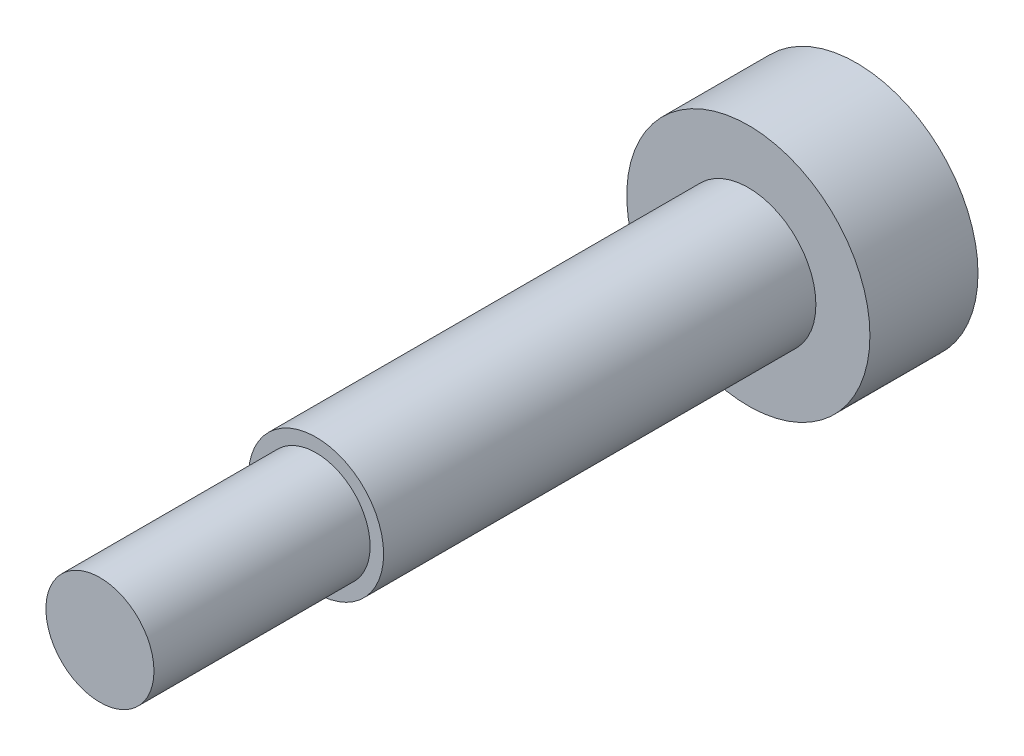
ISO-10303-21;
HEADER;
FILE_DESCRIPTION(('STEP AP214'),'2;1');
FILE_NAME('part.step','',(''),(''),'','','');
FILE_SCHEMA(('AUTOMOTIVE_DESIGN { 1 0 10303 214 1 1 1 1 }'));
ENDSEC;
DATA;
#1=APPLICATION_CONTEXT('core data for automotive mechanical design processes');
#2=APPLICATION_PROTOCOL_DEFINITION('international standard','automotive_design',2000,#1);
#3=PRODUCT_CONTEXT('',#1,'mechanical');
#4=PRODUCT('Part','Part','',(#3));
#5=PRODUCT_RELATED_PRODUCT_CATEGORY('part','',(#4));
#6=PRODUCT_DEFINITION_FORMATION('','',#4);
#7=PRODUCT_DEFINITION_CONTEXT('part definition',#1,'design');
#8=PRODUCT_DEFINITION('design','',#6,#7);
#9=PRODUCT_DEFINITION_SHAPE('','',#8);
#10=(LENGTH_UNIT() NAMED_UNIT(*) SI_UNIT(.MILLI.,.METRE.));
#11=(NAMED_UNIT(*) PLANE_ANGLE_UNIT() SI_UNIT($,.RADIAN.));
#12=(NAMED_UNIT(*) SI_UNIT($,.STERADIAN.) SOLID_ANGLE_UNIT());
#13=UNCERTAINTY_MEASURE_WITH_UNIT(LENGTH_MEASURE(1.E-05),#10,'distance_accuracy_value','');
#14=(GEOMETRIC_REPRESENTATION_CONTEXT(3) GLOBAL_UNCERTAINTY_ASSIGNED_CONTEXT((#13)) GLOBAL_UNIT_ASSIGNED_CONTEXT((#10,
#11,#12)) REPRESENTATION_CONTEXT('',''));
#15=CARTESIAN_POINT('',(0.,0.,0.));
#16=DIRECTION('',(0.,0.,1.));
#17=DIRECTION('',(1.,0.,0.));
#18=AXIS2_PLACEMENT_3D('',#15,#16,#17);
#19=CARTESIAN_POINT('',(0.,0.,-4.));
#20=DIRECTION('',(0.,0.,1.));
#21=DIRECTION('',(1.,0.,0.));
#22=AXIS2_PLACEMENT_3D('',#19,#20,#21);
#23=PLANE('',#22);
#24=CARTESIAN_POINT('',(0.,0.,-4.));
#25=DIRECTION('',(0.,0.,1.));
#26=DIRECTION('',(1.,0.,0.));
#27=AXIS2_PLACEMENT_3D('',#24,#25,#26);
#28=CIRCLE('',#27,4.5);
#29=CARTESIAN_POINT('',(4.5,0.,-4.));
#30=VERTEX_POINT('',#29);
#31=EDGE_CURVE('E110',#30,#30,#28,.T.);
#32=ORIENTED_EDGE('',*,*,#31,.F.);
#33=EDGE_LOOP('',(#32));
#34=FACE_BOUND('',#33,.T.);
#35=DIRECTION('',(-0.5,-0.866025403784439,0.));
#36=VECTOR('',#35,1.);
#37=CARTESIAN_POINT('',(1.08253175473055,-0.625,-4.));
#38=LINE('',#37,#36);
#39=CARTESIAN_POINT('',(1.44337567297406,0.,-4.));
#40=VERTEX_POINT('',#39);
#41=CARTESIAN_POINT('',(0.721687836487032,-1.25,-4.));
#42=VERTEX_POINT('',#41);
#43=EDGE_CURVE('E11',#40,#42,#38,.T.);
#44=ORIENTED_EDGE('',*,*,#43,.F.);
#45=DIRECTION('',(0.5,-0.866025403784439,0.));
#46=VECTOR('',#45,1.);
#47=CARTESIAN_POINT('',(1.08253175473055,0.625,-4.));
#48=LINE('',#47,#46);
#49=CARTESIAN_POINT('',(0.721687836487032,1.25,-4.));
#50=VERTEX_POINT('',#49);
#51=EDGE_CURVE('E50',#50,#40,#48,.T.);
#52=ORIENTED_EDGE('',*,*,#51,.F.);
#53=DIRECTION('',(1.,0.,0.));
#54=VECTOR('',#53,1.);
#55=CARTESIAN_POINT('',(0.,1.25,-4.));
#56=LINE('',#55,#54);
#57=CARTESIAN_POINT('',(-0.721687836487032,1.25,-4.));
#58=VERTEX_POINT('',#57);
#59=EDGE_CURVE('E137',#58,#50,#56,.T.);
#60=ORIENTED_EDGE('',*,*,#59,.F.);
#61=DIRECTION('',(0.5,0.866025403784439,0.));
#62=VECTOR('',#61,1.);
#63=CARTESIAN_POINT('',(-1.08253175473055,0.625,-4.));
#64=LINE('',#63,#62);
#65=CARTESIAN_POINT('',(-1.44337567297406,0.,-4.));
#66=VERTEX_POINT('',#65);
#67=EDGE_CURVE('E134',#66,#58,#64,.T.);
#68=ORIENTED_EDGE('',*,*,#67,.F.);
#69=DIRECTION('',(-0.5,0.866025403784439,0.));
#70=VECTOR('',#69,1.);
#71=CARTESIAN_POINT('',(-1.08253175473055,-0.625,-4.));
#72=LINE('',#71,#70);
#73=CARTESIAN_POINT('',(-0.721687836487033,-1.25,-4.));
#74=VERTEX_POINT('',#73);
#75=EDGE_CURVE('E132',#74,#66,#72,.T.);
#76=ORIENTED_EDGE('',*,*,#75,.F.);
#77=DIRECTION('',(-1.,0.,0.));
#78=VECTOR('',#77,1.);
#79=CARTESIAN_POINT('',(0.,-1.25,-4.));
#80=LINE('',#79,#78);
#81=EDGE_CURVE('E130',#42,#74,#80,.T.);
#82=ORIENTED_EDGE('',*,*,#81,.F.);
#83=EDGE_LOOP('',(#44,#52,#60,#68,#76,#82));
#84=FACE_BOUND('',#83,.T.);
#85=ADVANCED_FACE('F39',(#34,#84),#23,.F.);
#86=CARTESIAN_POINT('',(0.,0.,16.));
#87=DIRECTION('',(0.,0.,-1.));
#88=DIRECTION('',(-1.,0.,0.));
#89=AXIS2_PLACEMENT_3D('',#86,#87,#88);
#90=CYLINDRICAL_SURFACE('',#89,2.5);
#91=CARTESIAN_POINT('',(0.,0.,16.));
#92=DIRECTION('',(0.,0.,1.));
#93=DIRECTION('',(1.,0.,0.));
#94=AXIS2_PLACEMENT_3D('',#91,#92,#93);
#95=CIRCLE('',#94,2.5);
#96=CARTESIAN_POINT('',(2.5,0.,16.));
#97=VERTEX_POINT('',#96);
#98=EDGE_CURVE('E124',#97,#97,#95,.T.);
#99=ORIENTED_EDGE('',*,*,#98,.F.);
#100=EDGE_LOOP('',(#99));
#101=FACE_BOUND('',#100,.T.);
#102=CARTESIAN_POINT('',(0.,0.,0.));
#103=DIRECTION('',(0.,0.,1.));
#104=DIRECTION('',(1.,0.,0.));
#105=AXIS2_PLACEMENT_3D('',#102,#103,#104);
#106=CIRCLE('',#105,2.5);
#107=CARTESIAN_POINT('',(2.5,0.,0.));
#108=VERTEX_POINT('',#107);
#109=EDGE_CURVE('E117',#108,#108,#106,.T.);
#110=ORIENTED_EDGE('',*,*,#109,.T.);
#111=EDGE_LOOP('',(#110));
#112=FACE_BOUND('',#111,.T.);
#113=ADVANCED_FACE('F41',(#101,#112),#90,.T.);
#114=CARTESIAN_POINT('',(0.,0.,16.));
#115=DIRECTION('',(0.,0.,1.));
#116=DIRECTION('',(1.,0.,0.));
#117=AXIS2_PLACEMENT_3D('',#114,#115,#116);
#118=PLANE('',#117);
#119=CARTESIAN_POINT('',(0.,0.,16.));
#120=DIRECTION('',(0.,0.,1.));
#121=DIRECTION('',(1.,0.,0.));
#122=AXIS2_PLACEMENT_3D('',#119,#120,#121);
#123=CIRCLE('',#122,2.);
#124=CARTESIAN_POINT('',(2.,0.,16.));
#125=VERTEX_POINT('',#124);
#126=EDGE_CURVE('E121',#125,#125,#123,.T.);
#127=ORIENTED_EDGE('',*,*,#126,.F.);
#128=EDGE_LOOP('',(#127));
#129=FACE_BOUND('',#128,.T.);
#130=ORIENTED_EDGE('',*,*,#98,.T.);
#131=EDGE_LOOP('',(#130));
#132=FACE_BOUND('',#131,.T.);
#133=ADVANCED_FACE('F184',(#129,#132),#118,.T.);
#134=CARTESIAN_POINT('',(0.,0.,24.));
#135=DIRECTION('',(0.,0.,-1.));
#136=DIRECTION('',(-1.,0.,0.));
#137=AXIS2_PLACEMENT_3D('',#134,#135,#136);
#138=CYLINDRICAL_SURFACE('',#137,2.);
#139=CARTESIAN_POINT('',(0.,0.,24.));
#140=DIRECTION('',(0.,0.,1.));
#141=DIRECTION('',(1.,0.,0.));
#142=AXIS2_PLACEMENT_3D('',#139,#140,#141);
#143=CIRCLE('',#142,2.);
#144=CARTESIAN_POINT('',(2.,0.,24.));
#145=VERTEX_POINT('',#144);
#146=EDGE_CURVE('E119',#145,#145,#143,.T.);
#147=ORIENTED_EDGE('',*,*,#146,.F.);
#148=EDGE_LOOP('',(#147));
#149=FACE_BOUND('',#148,.T.);
#150=ORIENTED_EDGE('',*,*,#126,.T.);
#151=EDGE_LOOP('',(#150));
#152=FACE_BOUND('',#151,.T.);
#153=ADVANCED_FACE('F198',(#149,#152),#138,.T.);
#154=CARTESIAN_POINT('',(0.,0.,24.));
#155=DIRECTION('',(0.,0.,1.));
#156=DIRECTION('',(1.,0.,0.));
#157=AXIS2_PLACEMENT_3D('',#154,#155,#156);
#158=PLANE('',#157);
#159=ORIENTED_EDGE('',*,*,#146,.T.);
#160=EDGE_LOOP('',(#159));
#161=FACE_BOUND('',#160,.T.);
#162=ADVANCED_FACE('F193',(#161),#158,.T.);
#163=CARTESIAN_POINT('',(0.,0.,0.));
#164=DIRECTION('',(0.,0.,-1.));
#165=DIRECTION('',(-1.,0.,0.));
#166=AXIS2_PLACEMENT_3D('',#163,#164,#165);
#167=CYLINDRICAL_SURFACE('',#166,4.5);
#168=CARTESIAN_POINT('',(0.,0.,0.));
#169=DIRECTION('',(0.,0.,1.));
#170=DIRECTION('',(1.,0.,0.));
#171=AXIS2_PLACEMENT_3D('',#168,#169,#170);
#172=CIRCLE('',#171,4.5);
#173=CARTESIAN_POINT('',(4.5,0.,0.));
#174=VERTEX_POINT('',#173);
#175=EDGE_CURVE('E111',#174,#174,#172,.T.);
#176=ORIENTED_EDGE('',*,*,#175,.F.);
#177=EDGE_LOOP('',(#176));
#178=FACE_BOUND('',#177,.T.);
#179=ORIENTED_EDGE('',*,*,#31,.T.);
#180=EDGE_LOOP('',(#179));
#181=FACE_BOUND('',#180,.T.);
#182=ADVANCED_FACE('F195',(#178,#181),#167,.T.);
#183=CARTESIAN_POINT('',(0.,0.,0.));
#184=DIRECTION('',(0.,0.,1.));
#185=DIRECTION('',(1.,0.,0.));
#186=AXIS2_PLACEMENT_3D('',#183,#184,#185);
#187=PLANE('',#186);
#188=ORIENTED_EDGE('',*,*,#109,.F.);
#189=EDGE_LOOP('',(#188));
#190=FACE_BOUND('',#189,.T.);
#191=ORIENTED_EDGE('',*,*,#175,.T.);
#192=EDGE_LOOP('',(#191));
#193=FACE_BOUND('',#192,.T.);
#194=ADVANCED_FACE('F188',(#190,#193),#187,.T.);
#195=CARTESIAN_POINT('',(0.721687836487032,-1.25,-1.3));
#196=DIRECTION('',(-0.866025403784439,0.5,0.));
#197=DIRECTION('',(-0.5,-0.866025403784439,0.));
#198=AXIS2_PLACEMENT_3D('',#195,#196,#197);
#199=PLANE('',#198);
#200=ORIENTED_EDGE('',*,*,#43,.T.);
#201=DIRECTION('',(0.,0.,-1.));
#202=VECTOR('',#201,1.);
#203=CARTESIAN_POINT('',(0.721687836487032,-1.25,-1.3));
#204=LINE('',#203,#202);
#205=CARTESIAN_POINT('',(0.721687836487032,-1.25,-1.3));
#206=VERTEX_POINT('',#205);
#207=EDGE_CURVE('E53',#206,#42,#204,.T.);
#208=ORIENTED_EDGE('',*,*,#207,.F.);
#209=DIRECTION('',(0.5,0.866025403784439,0.));
#210=VECTOR('',#209,1.);
#211=CARTESIAN_POINT('',(0.721687836487032,-1.25,-1.3));
#212=LINE('',#211,#210);
#213=CARTESIAN_POINT('',(1.44337567297406,0.,-1.3));
#214=VERTEX_POINT('',#213);
#215=EDGE_CURVE('E98',#206,#214,#212,.T.);
#216=ORIENTED_EDGE('',*,*,#215,.T.);
#217=DIRECTION('',(0.,0.,-1.));
#218=VECTOR('',#217,1.);
#219=CARTESIAN_POINT('',(1.44337567297406,0.,-1.3));
#220=LINE('',#219,#218);
#221=EDGE_CURVE('E101',#214,#40,#220,.T.);
#222=ORIENTED_EDGE('',*,*,#221,.T.);
#223=EDGE_LOOP('',(#200,#208,#216,#222));
#224=FACE_BOUND('',#223,.T.);
#225=ADVANCED_FACE('F105',(#224),#199,.T.);
#226=CARTESIAN_POINT('',(1.44337567297406,0.,-1.3));
#227=DIRECTION('',(-0.866025403784439,-0.5,0.));
#228=DIRECTION('',(0.5,-0.866025403784439,0.));
#229=AXIS2_PLACEMENT_3D('',#226,#227,#228);
#230=PLANE('',#229);
#231=ORIENTED_EDGE('',*,*,#51,.T.);
#232=ORIENTED_EDGE('',*,*,#221,.F.);
#233=DIRECTION('',(-0.5,0.866025403784439,0.));
#234=VECTOR('',#233,1.);
#235=CARTESIAN_POINT('',(1.44337567297406,0.,-1.3));
#236=LINE('',#235,#234);
#237=CARTESIAN_POINT('',(0.721687836487032,1.25,-1.3));
#238=VERTEX_POINT('',#237);
#239=EDGE_CURVE('E92',#214,#238,#236,.T.);
#240=ORIENTED_EDGE('',*,*,#239,.T.);
#241=DIRECTION('',(0.,0.,-1.));
#242=VECTOR('',#241,1.);
#243=CARTESIAN_POINT('',(0.721687836487032,1.25,-1.3));
#244=LINE('',#243,#242);
#245=EDGE_CURVE('E108',#238,#50,#244,.T.);
#246=ORIENTED_EDGE('',*,*,#245,.T.);
#247=EDGE_LOOP('',(#231,#232,#240,#246));
#248=FACE_BOUND('',#247,.T.);
#249=ADVANCED_FACE('F106',(#248),#230,.T.);
#250=CARTESIAN_POINT('',(0.721687836487032,1.25,-1.3));
#251=DIRECTION('',(0.,-1.,0.));
#252=DIRECTION('',(1.,0.,0.));
#253=AXIS2_PLACEMENT_3D('',#250,#251,#252);
#254=PLANE('',#253);
#255=ORIENTED_EDGE('',*,*,#59,.T.);
#256=ORIENTED_EDGE('',*,*,#245,.F.);
#257=DIRECTION('',(-1.,0.,0.));
#258=VECTOR('',#257,1.);
#259=CARTESIAN_POINT('',(0.721687836487032,1.25,-1.3));
#260=LINE('',#259,#258);
#261=CARTESIAN_POINT('',(-0.721687836487032,1.25,-1.3));
#262=VERTEX_POINT('',#261);
#263=EDGE_CURVE('E96',#238,#262,#260,.T.);
#264=ORIENTED_EDGE('',*,*,#263,.T.);
#265=DIRECTION('',(0.,0.,-1.));
#266=VECTOR('',#265,1.);
#267=CARTESIAN_POINT('',(-0.721687836487032,1.25,-1.3));
#268=LINE('',#267,#266);
#269=EDGE_CURVE('E113',#262,#58,#268,.T.);
#270=ORIENTED_EDGE('',*,*,#269,.T.);
#271=EDGE_LOOP('',(#255,#256,#264,#270));
#272=FACE_BOUND('',#271,.T.);
#273=ADVANCED_FACE('F142',(#272),#254,.T.);
#274=CARTESIAN_POINT('',(-0.721687836487032,1.25,-1.3));
#275=DIRECTION('',(0.866025403784439,-0.5,0.));
#276=DIRECTION('',(0.5,0.866025403784439,0.));
#277=AXIS2_PLACEMENT_3D('',#274,#275,#276);
#278=PLANE('',#277);
#279=ORIENTED_EDGE('',*,*,#67,.T.);
#280=ORIENTED_EDGE('',*,*,#269,.F.);
#281=DIRECTION('',(-0.5,-0.866025403784439,0.));
#282=VECTOR('',#281,1.);
#283=CARTESIAN_POINT('',(-0.721687836487032,1.25,-1.3));
#284=LINE('',#283,#282);
#285=CARTESIAN_POINT('',(-1.44337567297406,0.,-1.3));
#286=VERTEX_POINT('',#285);
#287=EDGE_CURVE('E164',#262,#286,#284,.T.);
#288=ORIENTED_EDGE('',*,*,#287,.T.);
#289=DIRECTION('',(0.,0.,-1.));
#290=VECTOR('',#289,1.);
#291=CARTESIAN_POINT('',(-1.44337567297406,0.,-1.3));
#292=LINE('',#291,#290);
#293=EDGE_CURVE('E157',#286,#66,#292,.T.);
#294=ORIENTED_EDGE('',*,*,#293,.T.);
#295=EDGE_LOOP('',(#279,#280,#288,#294));
#296=FACE_BOUND('',#295,.T.);
#297=ADVANCED_FACE('F166',(#296),#278,.T.);
#298=CARTESIAN_POINT('',(-1.44337567297406,0.,-1.3));
#299=DIRECTION('',(0.866025403784439,0.5,0.));
#300=DIRECTION('',(-0.5,0.866025403784439,0.));
#301=AXIS2_PLACEMENT_3D('',#298,#299,#300);
#302=PLANE('',#301);
#303=ORIENTED_EDGE('',*,*,#75,.T.);
#304=ORIENTED_EDGE('',*,*,#293,.F.);
#305=DIRECTION('',(0.5,-0.866025403784439,0.));
#306=VECTOR('',#305,1.);
#307=CARTESIAN_POINT('',(-1.44337567297406,0.,-1.3));
#308=LINE('',#307,#306);
#309=CARTESIAN_POINT('',(-0.721687836487033,-1.25,-1.3));
#310=VERTEX_POINT('',#309);
#311=EDGE_CURVE('E156',#286,#310,#308,.T.);
#312=ORIENTED_EDGE('',*,*,#311,.T.);
#313=DIRECTION('',(0.,0.,-1.));
#314=VECTOR('',#313,1.);
#315=CARTESIAN_POINT('',(-0.721687836487033,-1.25,-1.3));
#316=LINE('',#315,#314);
#317=EDGE_CURVE('E148',#310,#74,#316,.T.);
#318=ORIENTED_EDGE('',*,*,#317,.T.);
#319=EDGE_LOOP('',(#303,#304,#312,#318));
#320=FACE_BOUND('',#319,.T.);
#321=ADVANCED_FACE('F155',(#320),#302,.T.);
#322=CARTESIAN_POINT('',(-0.721687836487033,-1.25,-1.3));
#323=DIRECTION('',(0.,1.,0.));
#324=DIRECTION('',(-1.,0.,0.));
#325=AXIS2_PLACEMENT_3D('',#322,#323,#324);
#326=PLANE('',#325);
#327=ORIENTED_EDGE('',*,*,#81,.T.);
#328=ORIENTED_EDGE('',*,*,#317,.F.);
#329=DIRECTION('',(1.,0.,0.));
#330=VECTOR('',#329,1.);
#331=CARTESIAN_POINT('',(-0.721687836487033,-1.25,-1.3));
#332=LINE('',#331,#330);
#333=EDGE_CURVE('E160',#310,#206,#332,.T.);
#334=ORIENTED_EDGE('',*,*,#333,.T.);
#335=ORIENTED_EDGE('',*,*,#207,.T.);
#336=EDGE_LOOP('',(#327,#328,#334,#335));
#337=FACE_BOUND('',#336,.T.);
#338=ADVANCED_FACE('F146',(#337),#326,.T.);
#339=CARTESIAN_POINT('',(0.,0.,-1.3));
#340=DIRECTION('',(0.,0.,1.));
#341=DIRECTION('',(1.,0.,0.));
#342=AXIS2_PLACEMENT_3D('',#339,#340,#341);
#343=PLANE('',#342);
#344=ORIENTED_EDGE('',*,*,#215,.F.);
#345=ORIENTED_EDGE('',*,*,#333,.F.);
#346=ORIENTED_EDGE('',*,*,#311,.F.);
#347=ORIENTED_EDGE('',*,*,#287,.F.);
#348=ORIENTED_EDGE('',*,*,#263,.F.);
#349=ORIENTED_EDGE('',*,*,#239,.F.);
#350=EDGE_LOOP('',(#344,#345,#346,#347,#348,#349));
#351=FACE_BOUND('',#350,.T.);
#352=ADVANCED_FACE('F93',(#351),#343,.F.);
#353=CLOSED_SHELL('',(#85,#113,#133,#153,#162,#182,#194,#225,#249,#273,#297,#321,#338,#352));
#354=MANIFOLD_SOLID_BREP('B2',#353);
#355=ADVANCED_BREP_SHAPE_REPRESENTATION('',(#18,#354),#14);
#356=SHAPE_DEFINITION_REPRESENTATION(#9,#355);
ENDSEC;
END-ISO-10303-21;
